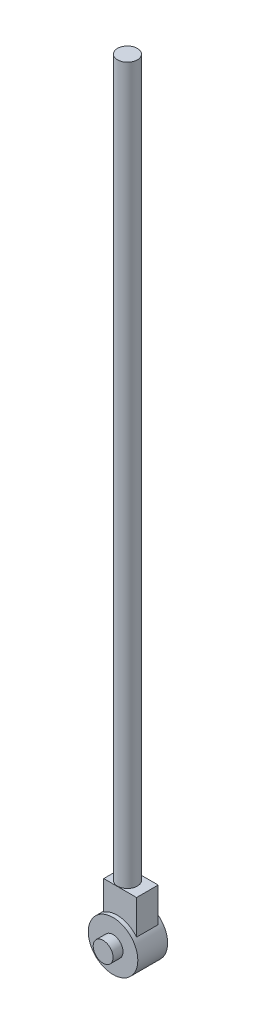
ISO-10303-21;
HEADER;
FILE_DESCRIPTION(('STEP AP214'),'2;1');
FILE_NAME('part.step','',(''),(''),'','','');
FILE_SCHEMA(('AUTOMOTIVE_DESIGN { 1 0 10303 214 1 1 1 1 }'));
ENDSEC;
DATA;
#1=APPLICATION_CONTEXT('core data for automotive mechanical design processes');
#2=APPLICATION_PROTOCOL_DEFINITION('international standard','automotive_design',2000,#1);
#3=PRODUCT_CONTEXT('',#1,'mechanical');
#4=PRODUCT('Part','Part','',(#3));
#5=PRODUCT_RELATED_PRODUCT_CATEGORY('part','',(#4));
#6=PRODUCT_DEFINITION_FORMATION('','',#4);
#7=PRODUCT_DEFINITION_CONTEXT('part definition',#1,'design');
#8=PRODUCT_DEFINITION('design','',#6,#7);
#9=PRODUCT_DEFINITION_SHAPE('','',#8);
#10=(LENGTH_UNIT() NAMED_UNIT(*) SI_UNIT(.MILLI.,.METRE.));
#11=(NAMED_UNIT(*) PLANE_ANGLE_UNIT() SI_UNIT($,.RADIAN.));
#12=(NAMED_UNIT(*) SI_UNIT($,.STERADIAN.) SOLID_ANGLE_UNIT());
#13=UNCERTAINTY_MEASURE_WITH_UNIT(LENGTH_MEASURE(1.E-05),#10,'distance_accuracy_value','');
#14=(GEOMETRIC_REPRESENTATION_CONTEXT(3) GLOBAL_UNCERTAINTY_ASSIGNED_CONTEXT((#13)) GLOBAL_UNIT_ASSIGNED_CONTEXT((#10,
#11,#12)) REPRESENTATION_CONTEXT('',''));
#15=CARTESIAN_POINT('',(0.,0.,0.));
#16=DIRECTION('',(0.,0.,1.));
#17=DIRECTION('',(1.,0.,0.));
#18=AXIS2_PLACEMENT_3D('',#15,#16,#17);
#19=CARTESIAN_POINT('',(0.,0.,3.));
#20=DIRECTION('',(0.,0.,-1.));
#21=DIRECTION('',(-1.,0.,0.));
#22=AXIS2_PLACEMENT_3D('',#19,#20,#21);
#23=CYLINDRICAL_SURFACE('',#22,2.49);
#24=CARTESIAN_POINT('',(0.,0.,0.));
#25=DIRECTION('',(0.,0.,1.));
#26=DIRECTION('',(1.,0.,0.));
#27=AXIS2_PLACEMENT_3D('',#24,#25,#26);
#28=CIRCLE('',#27,2.49);
#29=CARTESIAN_POINT('',(2.49,0.,0.));
#30=VERTEX_POINT('',#29);
#31=EDGE_CURVE('E107',#30,#30,#28,.T.);
#32=ORIENTED_EDGE('',*,*,#31,.T.);
#33=EDGE_LOOP('',(#32));
#34=FACE_BOUND('',#33,.T.);
#35=CARTESIAN_POINT('',(0.,0.,3.));
#36=DIRECTION('',(0.,0.,1.));
#37=DIRECTION('',(1.,0.,0.));
#38=AXIS2_PLACEMENT_3D('',#35,#36,#37);
#39=CIRCLE('',#38,2.49);
#40=CARTESIAN_POINT('',(2.49,0.,3.));
#41=VERTEX_POINT('',#40);
#42=EDGE_CURVE('E108',#41,#41,#39,.T.);
#43=ORIENTED_EDGE('',*,*,#42,.F.);
#44=EDGE_LOOP('',(#43));
#45=FACE_BOUND('',#44,.T.);
#46=DIRECTION('',(0.,0.,-1.));
#47=VECTOR('',#46,1.);
#48=CARTESIAN_POINT('',(1.95218538526207,1.54566238925879,3.));
#49=LINE('',#48,#47);
#50=CARTESIAN_POINT('',(1.95218538526207,1.54566238925879,2.58854576781894));
#51=VERTEX_POINT('',#50);
#52=CARTESIAN_POINT('',(1.95218538526207,1.54566238925879,0.411454232181057));
#53=VERTEX_POINT('',#52);
#54=EDGE_CURVE('E11',#51,#53,#49,.T.);
#55=ORIENTED_EDGE('',*,*,#54,.F.);
#56=CARTESIAN_POINT('',(0.,0.,2.58854576781894));
#57=DIRECTION('',(0.,0.,-1.));
#58=DIRECTION('',(-1.,0.,0.));
#59=AXIS2_PLACEMENT_3D('',#56,#57,#58);
#60=CIRCLE('',#59,2.49);
#61=CARTESIAN_POINT('',(-1.35159802836426,2.09123952949485,2.58854576781894));
#62=VERTEX_POINT('',#61);
#63=EDGE_CURVE('E116',#62,#51,#60,.T.);
#64=ORIENTED_EDGE('',*,*,#63,.F.);
#65=DIRECTION('',(0.,0.,-1.));
#66=VECTOR('',#65,1.);
#67=CARTESIAN_POINT('',(-1.35159802836426,2.09123952949485,3.));
#68=LINE('',#67,#66);
#69=CARTESIAN_POINT('',(-1.35159802836426,2.09123952949485,0.411454232181057));
#70=VERTEX_POINT('',#69);
#71=EDGE_CURVE('E52',#70,#62,#68,.F.);
#72=ORIENTED_EDGE('',*,*,#71,.F.);
#73=CARTESIAN_POINT('',(0.,0.,0.411454232181057));
#74=DIRECTION('',(0.,0.,1.));
#75=DIRECTION('',(1.,0.,0.));
#76=AXIS2_PLACEMENT_3D('',#73,#74,#75);
#77=CIRCLE('',#76,2.49);
#78=EDGE_CURVE('E42',#53,#70,#77,.T.);
#79=ORIENTED_EDGE('',*,*,#78,.F.);
#80=EDGE_LOOP('',(#55,#64,#72,#79));
#81=FACE_BOUND('',#80,.T.);
#82=ADVANCED_FACE('F35',(#34,#45,#81),#23,.T.);
#83=CARTESIAN_POINT('',(0.,0.,3.));
#84=DIRECTION('',(0.,0.,1.));
#85=DIRECTION('',(1.,0.,0.));
#86=AXIS2_PLACEMENT_3D('',#83,#84,#85);
#87=PLANE('',#86);
#88=CARTESIAN_POINT('',(0.,0.,3.));
#89=DIRECTION('',(0.,0.,1.));
#90=DIRECTION('',(1.,0.,0.));
#91=AXIS2_PLACEMENT_3D('',#88,#89,#90);
#92=CIRCLE('',#91,1.);
#93=CARTESIAN_POINT('',(1.,0.,3.));
#94=VERTEX_POINT('',#93);
#95=EDGE_CURVE('E104',#94,#94,#92,.F.);
#96=ORIENTED_EDGE('',*,*,#95,.T.);
#97=EDGE_LOOP('',(#96));
#98=FACE_BOUND('',#97,.T.);
#99=ORIENTED_EDGE('',*,*,#42,.T.);
#100=EDGE_LOOP('',(#99));
#101=FACE_BOUND('',#100,.T.);
#102=ADVANCED_FACE('F130',(#98,#101),#87,.T.);
#103=CARTESIAN_POINT('',(0.,0.,0.));
#104=DIRECTION('',(0.,0.,1.));
#105=DIRECTION('',(1.,0.,0.));
#106=AXIS2_PLACEMENT_3D('',#103,#104,#105);
#107=PLANE('',#106);
#108=CARTESIAN_POINT('',(0.,0.,0.));
#109=DIRECTION('',(0.,0.,1.));
#110=DIRECTION('',(1.,0.,0.));
#111=AXIS2_PLACEMENT_3D('',#108,#109,#110);
#112=CIRCLE('',#111,1.);
#113=CARTESIAN_POINT('',(1.,0.,0.));
#114=VERTEX_POINT('',#113);
#115=EDGE_CURVE('E111',#114,#114,#112,.F.);
#116=ORIENTED_EDGE('',*,*,#115,.F.);
#117=EDGE_LOOP('',(#116));
#118=FACE_BOUND('',#117,.T.);
#119=ORIENTED_EDGE('',*,*,#31,.F.);
#120=EDGE_LOOP('',(#119));
#121=FACE_BOUND('',#120,.T.);
#122=ADVANCED_FACE('F135',(#118,#121),#107,.F.);
#123=CARTESIAN_POINT('',(0.,0.,-1.));
#124=DIRECTION('',(0.,0.,1.));
#125=DIRECTION('',(1.,0.,0.));
#126=AXIS2_PLACEMENT_3D('',#123,#124,#125);
#127=PLANE('',#126);
#128=CARTESIAN_POINT('',(0.,0.,-1.));
#129=DIRECTION('',(0.,0.,1.));
#130=DIRECTION('',(1.,0.,0.));
#131=AXIS2_PLACEMENT_3D('',#128,#129,#130);
#132=CIRCLE('',#131,1.);
#133=CARTESIAN_POINT('',(1.,0.,-1.));
#134=VERTEX_POINT('',#133);
#135=EDGE_CURVE('E93',#134,#134,#132,.T.);
#136=ORIENTED_EDGE('',*,*,#135,.F.);
#137=EDGE_LOOP('',(#136));
#138=FACE_BOUND('',#137,.T.);
#139=ADVANCED_FACE('F144',(#138),#127,.F.);
#140=CARTESIAN_POINT('',(0.,0.,4.));
#141=DIRECTION('',(0.,0.,-1.));
#142=DIRECTION('',(-1.,0.,0.));
#143=AXIS2_PLACEMENT_3D('',#140,#141,#142);
#144=CYLINDRICAL_SURFACE('',#143,1.);
#145=ORIENTED_EDGE('',*,*,#135,.T.);
#146=EDGE_LOOP('',(#145));
#147=FACE_BOUND('',#146,.T.);
#148=ORIENTED_EDGE('',*,*,#115,.T.);
#149=EDGE_LOOP('',(#148));
#150=FACE_BOUND('',#149,.T.);
#151=ADVANCED_FACE('F149',(#147,#150),#144,.T.);
#152=ORIENTED_EDGE('',*,*,#95,.F.);
#153=EDGE_LOOP('',(#152));
#154=FACE_BOUND('',#153,.T.);
#155=CARTESIAN_POINT('',(0.,0.,4.));
#156=DIRECTION('',(0.,0.,1.));
#157=DIRECTION('',(1.,0.,0.));
#158=AXIS2_PLACEMENT_3D('',#155,#156,#157);
#159=CIRCLE('',#158,1.);
#160=CARTESIAN_POINT('',(1.,0.,4.));
#161=VERTEX_POINT('',#160);
#162=EDGE_CURVE('E96',#161,#161,#159,.T.);
#163=ORIENTED_EDGE('',*,*,#162,.F.);
#164=EDGE_LOOP('',(#163));
#165=FACE_BOUND('',#164,.T.);
#166=ADVANCED_FACE('F154',(#154,#165),#144,.T.);
#167=CARTESIAN_POINT('',(0.,0.,4.));
#168=DIRECTION('',(0.,0.,1.));
#169=DIRECTION('',(1.,0.,0.));
#170=AXIS2_PLACEMENT_3D('',#167,#168,#169);
#171=PLANE('',#170);
#172=ORIENTED_EDGE('',*,*,#162,.T.);
#173=EDGE_LOOP('',(#172));
#174=FACE_BOUND('',#173,.T.);
#175=ADVANCED_FACE('F157',(#174),#171,.T.);
#176=CARTESIAN_POINT('',(1.95218538526207,5.,0.411454232181057));
#177=DIRECTION('',(-1.,0.,0.));
#178=DIRECTION('',(0.,0.,1.));
#179=AXIS2_PLACEMENT_3D('',#176,#177,#178);
#180=PLANE('',#179);
#181=DIRECTION('',(0.,-1.,0.));
#182=VECTOR('',#181,1.);
#183=CARTESIAN_POINT('',(1.95218538526207,5.,2.58854576781894));
#184=LINE('',#183,#182);
#185=CARTESIAN_POINT('',(1.95218538526207,5.,2.58854576781894));
#186=VERTEX_POINT('',#185);
#187=EDGE_CURVE('E124',#186,#51,#184,.T.);
#188=ORIENTED_EDGE('',*,*,#187,.T.);
#189=ORIENTED_EDGE('',*,*,#54,.T.);
#190=DIRECTION('',(0.,-1.,0.));
#191=VECTOR('',#190,1.);
#192=CARTESIAN_POINT('',(1.95218538526207,5.,0.411454232181057));
#193=LINE('',#192,#191);
#194=CARTESIAN_POINT('',(1.95218538526207,5.,0.411454232181057));
#195=VERTEX_POINT('',#194);
#196=EDGE_CURVE('E75',#195,#53,#193,.T.);
#197=ORIENTED_EDGE('',*,*,#196,.F.);
#198=DIRECTION('',(0.,0.,-1.));
#199=VECTOR('',#198,1.);
#200=CARTESIAN_POINT('',(1.95218538526207,5.,0.411454232181057));
#201=LINE('',#200,#199);
#202=EDGE_CURVE('E81',#186,#195,#201,.T.);
#203=ORIENTED_EDGE('',*,*,#202,.F.);
#204=EDGE_LOOP('',(#188,#189,#197,#203));
#205=FACE_BOUND('',#204,.T.);
#206=ADVANCED_FACE('F92',(#205),#180,.F.);
#207=CARTESIAN_POINT('',(-1.35159802836426,5.,0.411454232181057));
#208=DIRECTION('',(1.,0.,0.));
#209=DIRECTION('',(0.,0.,-1.));
#210=AXIS2_PLACEMENT_3D('',#207,#208,#209);
#211=PLANE('',#210);
#212=DIRECTION('',(0.,-1.,0.));
#213=VECTOR('',#212,1.);
#214=CARTESIAN_POINT('',(-1.35159802836426,5.,0.411454232181057));
#215=LINE('',#214,#213);
#216=CARTESIAN_POINT('',(-1.35159802836426,5.,0.411454232181057));
#217=VERTEX_POINT('',#216);
#218=EDGE_CURVE('E77',#217,#70,#215,.T.);
#219=ORIENTED_EDGE('',*,*,#218,.T.);
#220=ORIENTED_EDGE('',*,*,#71,.T.);
#221=DIRECTION('',(0.,-1.,0.));
#222=VECTOR('',#221,1.);
#223=CARTESIAN_POINT('',(-1.35159802836426,5.,2.58854576781894));
#224=LINE('',#223,#222);
#225=CARTESIAN_POINT('',(-1.35159802836426,5.,2.58854576781894));
#226=VERTEX_POINT('',#225);
#227=EDGE_CURVE('E98',#226,#62,#224,.T.);
#228=ORIENTED_EDGE('',*,*,#227,.F.);
#229=DIRECTION('',(0.,0.,1.));
#230=VECTOR('',#229,1.);
#231=CARTESIAN_POINT('',(-1.35159802836426,5.,0.411454232181057));
#232=LINE('',#231,#230);
#233=EDGE_CURVE('E80',#217,#226,#232,.T.);
#234=ORIENTED_EDGE('',*,*,#233,.F.);
#235=EDGE_LOOP('',(#219,#220,#228,#234));
#236=FACE_BOUND('',#235,.T.);
#237=ADVANCED_FACE('F120',(#236),#211,.F.);
#238=CARTESIAN_POINT('',(-1.35159802836426,5.,0.411454232181057));
#239=DIRECTION('',(0.,0.,1.));
#240=DIRECTION('',(1.,0.,0.));
#241=AXIS2_PLACEMENT_3D('',#238,#239,#240);
#242=PLANE('',#241);
#243=ORIENTED_EDGE('',*,*,#196,.T.);
#244=ORIENTED_EDGE('',*,*,#78,.T.);
#245=ORIENTED_EDGE('',*,*,#218,.F.);
#246=DIRECTION('',(-1.,0.,0.));
#247=VECTOR('',#246,1.);
#248=CARTESIAN_POINT('',(-1.35159802836426,5.,0.411454232181057));
#249=LINE('',#248,#247);
#250=EDGE_CURVE('E71',#195,#217,#249,.T.);
#251=ORIENTED_EDGE('',*,*,#250,.F.);
#252=EDGE_LOOP('',(#243,#244,#245,#251));
#253=FACE_BOUND('',#252,.T.);
#254=ADVANCED_FACE('F73',(#253),#242,.F.);
#255=CARTESIAN_POINT('',(-1.35159802836426,5.,2.58854576781894));
#256=DIRECTION('',(0.,0.,-1.));
#257=DIRECTION('',(-1.,0.,0.));
#258=AXIS2_PLACEMENT_3D('',#255,#256,#257);
#259=PLANE('',#258);
#260=ORIENTED_EDGE('',*,*,#227,.T.);
#261=ORIENTED_EDGE('',*,*,#63,.T.);
#262=ORIENTED_EDGE('',*,*,#187,.F.);
#263=DIRECTION('',(1.,0.,0.));
#264=VECTOR('',#263,1.);
#265=CARTESIAN_POINT('',(-1.35159802836426,5.,2.58854576781894));
#266=LINE('',#265,#264);
#267=EDGE_CURVE('E86',#226,#186,#266,.T.);
#268=ORIENTED_EDGE('',*,*,#267,.F.);
#269=EDGE_LOOP('',(#260,#261,#262,#268));
#270=FACE_BOUND('',#269,.T.);
#271=ADVANCED_FACE('F128',(#270),#259,.F.);
#272=CARTESIAN_POINT('',(0.,5.,0.));
#273=DIRECTION('',(0.,1.,0.));
#274=DIRECTION('',(0.,0.,1.));
#275=AXIS2_PLACEMENT_3D('',#272,#273,#274);
#276=PLANE('',#275);
#277=CARTESIAN_POINT('',(0.,5.,1.55564004089115));
#278=DIRECTION('',(0.,1.,0.));
#279=DIRECTION('',(0.,0.,1.));
#280=AXIS2_PLACEMENT_3D('',#277,#278,#279);
#281=CIRCLE('',#280,1.);
#282=CARTESIAN_POINT('',(0.,5.,2.55564004089115));
#283=VERTEX_POINT('',#282);
#284=EDGE_CURVE('E184',#283,#283,#281,.T.);
#285=ORIENTED_EDGE('',*,*,#284,.F.);
#286=EDGE_LOOP('',(#285));
#287=FACE_BOUND('',#286,.T.);
#288=ORIENTED_EDGE('',*,*,#202,.T.);
#289=ORIENTED_EDGE('',*,*,#250,.T.);
#290=ORIENTED_EDGE('',*,*,#233,.T.);
#291=ORIENTED_EDGE('',*,*,#267,.T.);
#292=EDGE_LOOP('',(#288,#289,#290,#291));
#293=FACE_BOUND('',#292,.T.);
#294=ADVANCED_FACE('F84',(#287,#293),#276,.T.);
#295=CARTESIAN_POINT('',(0.,77.,1.55564004089115));
#296=DIRECTION('',(0.,-1.,0.));
#297=DIRECTION('',(0.,0.,-1.));
#298=AXIS2_PLACEMENT_3D('',#295,#296,#297);
#299=CYLINDRICAL_SURFACE('',#298,1.);
#300=CARTESIAN_POINT('',(0.,77.,1.55564004089115));
#301=DIRECTION('',(0.,1.,0.));
#302=DIRECTION('',(0.,0.,1.));
#303=AXIS2_PLACEMENT_3D('',#300,#301,#302);
#304=CIRCLE('',#303,1.);
#305=CARTESIAN_POINT('',(0.,77.,2.55564004089115));
#306=VERTEX_POINT('',#305);
#307=EDGE_CURVE('E90',#306,#306,#304,.T.);
#308=ORIENTED_EDGE('',*,*,#307,.F.);
#309=EDGE_LOOP('',(#308));
#310=FACE_BOUND('',#309,.T.);
#311=ORIENTED_EDGE('',*,*,#284,.T.);
#312=EDGE_LOOP('',(#311));
#313=FACE_BOUND('',#312,.T.);
#314=ADVANCED_FACE('F172',(#310,#313),#299,.T.);
#315=CARTESIAN_POINT('',(0.,77.,1.55564004089115));
#316=DIRECTION('',(0.,1.,0.));
#317=DIRECTION('',(0.,0.,1.));
#318=AXIS2_PLACEMENT_3D('',#315,#316,#317);
#319=PLANE('',#318);
#320=ORIENTED_EDGE('',*,*,#307,.T.);
#321=EDGE_LOOP('',(#320));
#322=FACE_BOUND('',#321,.T.);
#323=ADVANCED_FACE('F176',(#322),#319,.T.);
#324=CLOSED_SHELL('',(#82,#102,#122,#139,#151,#166,#175,#206,#237,#254,#271,#294,#314,#323));
#325=MANIFOLD_SOLID_BREP('B2',#324);
#326=ADVANCED_BREP_SHAPE_REPRESENTATION('',(#18,#325),#14);
#327=SHAPE_DEFINITION_REPRESENTATION(#9,#326);
ENDSEC;
END-ISO-10303-21;
